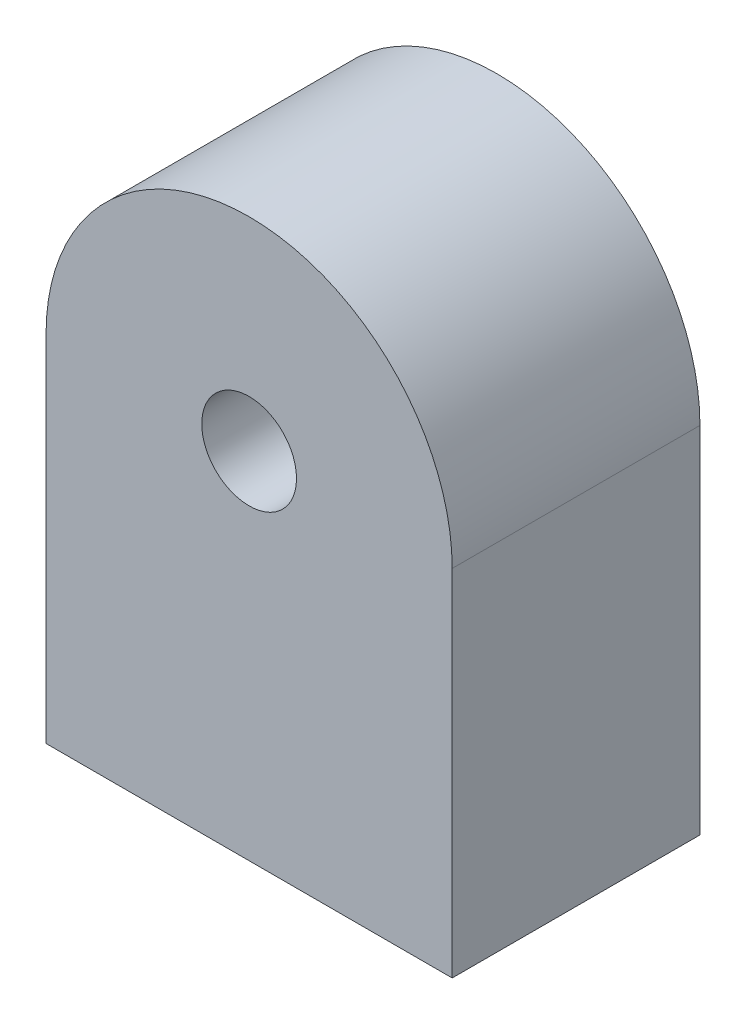
ISO-10303-21;
HEADER;
FILE_DESCRIPTION(('STEP AP214'),'2;1');
FILE_NAME('part.step','',(''),(''),'','','');
FILE_SCHEMA(('AUTOMOTIVE_DESIGN { 1 0 10303 214 1 1 1 1 }'));
ENDSEC;
DATA;
#1=APPLICATION_CONTEXT('core data for automotive mechanical design processes');
#2=APPLICATION_PROTOCOL_DEFINITION('international standard','automotive_design',2000,#1);
#3=PRODUCT_CONTEXT('',#1,'mechanical');
#4=PRODUCT('Part','Part','',(#3));
#5=PRODUCT_RELATED_PRODUCT_CATEGORY('part','',(#4));
#6=PRODUCT_DEFINITION_FORMATION('','',#4);
#7=PRODUCT_DEFINITION_CONTEXT('part definition',#1,'design');
#8=PRODUCT_DEFINITION('design','',#6,#7);
#9=PRODUCT_DEFINITION_SHAPE('','',#8);
#10=(LENGTH_UNIT() NAMED_UNIT(*) SI_UNIT(.MILLI.,.METRE.));
#11=(NAMED_UNIT(*) PLANE_ANGLE_UNIT() SI_UNIT($,.RADIAN.));
#12=(NAMED_UNIT(*) SI_UNIT($,.STERADIAN.) SOLID_ANGLE_UNIT());
#13=UNCERTAINTY_MEASURE_WITH_UNIT(LENGTH_MEASURE(1.E-05),#10,'distance_accuracy_value','');
#14=(GEOMETRIC_REPRESENTATION_CONTEXT(3) GLOBAL_UNCERTAINTY_ASSIGNED_CONTEXT((#13)) GLOBAL_UNIT_ASSIGNED_CONTEXT((#10,
#11,#12)) REPRESENTATION_CONTEXT('',''));
#15=CARTESIAN_POINT('',(0.,0.,0.));
#16=DIRECTION('',(0.,0.,1.));
#17=DIRECTION('',(1.,0.,0.));
#18=AXIS2_PLACEMENT_3D('',#15,#16,#17);
#19=CARTESIAN_POINT('',(0.,-12.1,0.));
#20=DIRECTION('',(0.,-1.,0.));
#21=DIRECTION('',(0.,0.,-1.));
#22=AXIS2_PLACEMENT_3D('',#19,#20,#21);
#23=PLANE('',#22);
#24=DIRECTION('',(0.,0.,1.));
#25=VECTOR('',#24,1.);
#26=CARTESIAN_POINT('',(7.25,-12.1,9.23));
#27=LINE('',#26,#25);
#28=CARTESIAN_POINT('',(7.25,-12.1,2.13));
#29=VERTEX_POINT('',#28);
#30=CARTESIAN_POINT('',(7.25,-12.1,9.23));
#31=VERTEX_POINT('',#30);
#32=EDGE_CURVE('E377',#29,#31,#27,.T.);
#33=ORIENTED_EDGE('',*,*,#32,.T.);
#34=DIRECTION('',(-1.,0.,0.));
#35=VECTOR('',#34,1.);
#36=CARTESIAN_POINT('',(-7.25,-12.1,9.23));
#37=LINE('',#36,#35);
#38=CARTESIAN_POINT('',(-7.25,-12.1,9.23));
#39=VERTEX_POINT('',#38);
#40=EDGE_CURVE('E380',#31,#39,#37,.T.);
#41=ORIENTED_EDGE('',*,*,#40,.T.);
#42=DIRECTION('',(0.,0.,-1.));
#43=VECTOR('',#42,1.);
#44=CARTESIAN_POINT('',(-7.25,-12.1,9.23));
#45=LINE('',#44,#43);
#46=CARTESIAN_POINT('',(-7.25,-12.1,2.13));
#47=VERTEX_POINT('',#46);
#48=EDGE_CURVE('E384',#39,#47,#45,.T.);
#49=ORIENTED_EDGE('',*,*,#48,.T.);
#50=DIRECTION('',(1.,0.,0.));
#51=VECTOR('',#50,1.);
#52=CARTESIAN_POINT('',(-7.25,-12.1,2.13));
#53=LINE('',#52,#51);
#54=EDGE_CURVE('E387',#47,#29,#53,.T.);
#55=ORIENTED_EDGE('',*,*,#54,.T.);
#56=EDGE_LOOP('',(#33,#41,#49,#55));
#57=FACE_BOUND('',#56,.T.);
#58=DIRECTION('',(-1.,0.,0.));
#59=VECTOR('',#58,1.);
#60=CARTESIAN_POINT('',(-0.320000000000001,-12.1,5.45));
#61=LINE('',#60,#59);
#62=CARTESIAN_POINT('',(0.319999999999999,-12.1,5.45));
#63=VERTEX_POINT('',#62);
#64=CARTESIAN_POINT('',(-0.320000000000001,-12.1,5.45));
#65=VERTEX_POINT('',#64);
#66=EDGE_CURVE('E361',#63,#65,#61,.T.);
#67=ORIENTED_EDGE('',*,*,#66,.F.);
#68=DIRECTION('',(0.,0.,1.));
#69=VECTOR('',#68,1.);
#70=CARTESIAN_POINT('',(0.319999999999999,-12.1,5.45));
#71=LINE('',#70,#69);
#72=CARTESIAN_POINT('',(0.32,-12.1,4.81));
#73=VERTEX_POINT('',#72);
#74=EDGE_CURVE('E317',#73,#63,#71,.T.);
#75=ORIENTED_EDGE('',*,*,#74,.F.);
#76=DIRECTION('',(1.,0.,0.));
#77=VECTOR('',#76,1.);
#78=CARTESIAN_POINT('',(-0.320000000000001,-12.1,4.81));
#79=LINE('',#78,#77);
#80=CARTESIAN_POINT('',(-0.320000000000001,-12.1,4.81));
#81=VERTEX_POINT('',#80);
#82=EDGE_CURVE('E352',#81,#73,#79,.T.);
#83=ORIENTED_EDGE('',*,*,#82,.F.);
#84=DIRECTION('',(0.,0.,-1.));
#85=VECTOR('',#84,1.);
#86=CARTESIAN_POINT('',(-0.320000000000001,-12.1,5.45));
#87=LINE('',#86,#85);
#88=EDGE_CURVE('E363',#65,#81,#87,.T.);
#89=ORIENTED_EDGE('',*,*,#88,.F.);
#90=EDGE_LOOP('',(#67,#75,#83,#89));
#91=FACE_BOUND('',#90,.T.);
#92=DIRECTION('',(-1.,0.,0.));
#93=VECTOR('',#92,1.);
#94=CARTESIAN_POINT('',(-2.22,-12.1,5.45));
#95=LINE('',#94,#93);
#96=CARTESIAN_POINT('',(-2.22,-12.1,5.45));
#97=VERTEX_POINT('',#96);
#98=CARTESIAN_POINT('',(-2.86,-12.1,5.45));
#99=VERTEX_POINT('',#98);
#100=EDGE_CURVE('E283',#97,#99,#95,.T.);
#101=ORIENTED_EDGE('',*,*,#100,.F.);
#102=DIRECTION('',(0.,0.,1.));
#103=VECTOR('',#102,1.);
#104=CARTESIAN_POINT('',(-2.22,-12.1,5.45));
#105=LINE('',#104,#103);
#106=CARTESIAN_POINT('',(-2.22,-12.1,4.81));
#107=VERTEX_POINT('',#106);
#108=EDGE_CURVE('E285',#107,#97,#105,.T.);
#109=ORIENTED_EDGE('',*,*,#108,.F.);
#110=DIRECTION('',(1.,0.,0.));
#111=VECTOR('',#110,1.);
#112=CARTESIAN_POINT('',(-2.22,-12.1,4.81));
#113=LINE('',#112,#111);
#114=CARTESIAN_POINT('',(-2.86,-12.1,4.81));
#115=VERTEX_POINT('',#114);
#116=EDGE_CURVE('E277',#115,#107,#113,.T.);
#117=ORIENTED_EDGE('',*,*,#116,.F.);
#118=DIRECTION('',(0.,0.,-1.));
#119=VECTOR('',#118,1.);
#120=CARTESIAN_POINT('',(-2.86,-12.1,5.45));
#121=LINE('',#120,#119);
#122=EDGE_CURVE('E279',#99,#115,#121,.T.);
#123=ORIENTED_EDGE('',*,*,#122,.F.);
#124=EDGE_LOOP('',(#101,#109,#117,#123));
#125=FACE_BOUND('',#124,.T.);
#126=DIRECTION('',(0.,0.,1.));
#127=VECTOR('',#126,1.);
#128=CARTESIAN_POINT('',(5.4,-12.1,5.45));
#129=LINE('',#128,#127);
#130=CARTESIAN_POINT('',(5.4,-12.1,4.81));
#131=VERTEX_POINT('',#130);
#132=CARTESIAN_POINT('',(5.4,-12.1,5.45));
#133=VERTEX_POINT('',#132);
#134=EDGE_CURVE('E251',#131,#133,#129,.T.);
#135=ORIENTED_EDGE('',*,*,#134,.F.);
#136=DIRECTION('',(1.,0.,0.));
#137=VECTOR('',#136,1.);
#138=CARTESIAN_POINT('',(4.76,-12.1,4.81));
#139=LINE('',#138,#137);
#140=CARTESIAN_POINT('',(4.76,-12.1,4.81));
#141=VERTEX_POINT('',#140);
#142=EDGE_CURVE('E245',#141,#131,#139,.T.);
#143=ORIENTED_EDGE('',*,*,#142,.F.);
#144=DIRECTION('',(0.,0.,-1.));
#145=VECTOR('',#144,1.);
#146=CARTESIAN_POINT('',(4.76,-12.1,5.45));
#147=LINE('',#146,#145);
#148=CARTESIAN_POINT('',(4.76,-12.1,5.45));
#149=VERTEX_POINT('',#148);
#150=EDGE_CURVE('E226',#149,#141,#147,.T.);
#151=ORIENTED_EDGE('',*,*,#150,.F.);
#152=DIRECTION('',(-1.,0.,0.));
#153=VECTOR('',#152,1.);
#154=CARTESIAN_POINT('',(4.76,-12.1,5.45));
#155=LINE('',#154,#153);
#156=EDGE_CURVE('E238',#133,#149,#155,.T.);
#157=ORIENTED_EDGE('',*,*,#156,.F.);
#158=EDGE_LOOP('',(#135,#143,#151,#157));
#159=FACE_BOUND('',#158,.T.);
#160=DIRECTION('',(-1.,0.,0.));
#161=VECTOR('',#160,1.);
#162=CARTESIAN_POINT('',(-4.76,-12.1,5.45));
#163=LINE('',#162,#161);
#164=CARTESIAN_POINT('',(-4.76,-12.1,5.45));
#165=VERTEX_POINT('',#164);
#166=CARTESIAN_POINT('',(-5.4,-12.1,5.45));
#167=VERTEX_POINT('',#166);
#168=EDGE_CURVE('E337',#165,#167,#163,.T.);
#169=ORIENTED_EDGE('',*,*,#168,.F.);
#170=DIRECTION('',(0.,0.,1.));
#171=VECTOR('',#170,1.);
#172=CARTESIAN_POINT('',(-4.76,-12.1,5.45));
#173=LINE('',#172,#171);
#174=CARTESIAN_POINT('',(-4.76,-12.1,4.81));
#175=VERTEX_POINT('',#174);
#176=EDGE_CURVE('E299',#175,#165,#173,.T.);
#177=ORIENTED_EDGE('',*,*,#176,.F.);
#178=DIRECTION('',(1.,0.,0.));
#179=VECTOR('',#178,1.);
#180=CARTESIAN_POINT('',(-4.76,-12.1,4.81));
#181=LINE('',#180,#179);
#182=CARTESIAN_POINT('',(-5.4,-12.1,4.81));
#183=VERTEX_POINT('',#182);
#184=EDGE_CURVE('E332',#183,#175,#181,.T.);
#185=ORIENTED_EDGE('',*,*,#184,.F.);
#186=DIRECTION('',(0.,0.,-1.));
#187=VECTOR('',#186,1.);
#188=CARTESIAN_POINT('',(-5.4,-12.1,5.45));
#189=LINE('',#188,#187);
#190=EDGE_CURVE('E334',#167,#183,#189,.T.);
#191=ORIENTED_EDGE('',*,*,#190,.F.);
#192=EDGE_LOOP('',(#169,#177,#185,#191));
#193=FACE_BOUND('',#192,.T.);
#194=DIRECTION('',(0.,0.,1.));
#195=VECTOR('',#194,1.);
#196=CARTESIAN_POINT('',(2.86,-12.1,5.45));
#197=LINE('',#196,#195);
#198=CARTESIAN_POINT('',(2.86,-12.1,4.81));
#199=VERTEX_POINT('',#198);
#200=CARTESIAN_POINT('',(2.86,-12.1,5.45));
#201=VERTEX_POINT('',#200);
#202=EDGE_CURVE('E312',#199,#201,#197,.T.);
#203=ORIENTED_EDGE('',*,*,#202,.F.);
#204=DIRECTION('',(1.,0.,0.));
#205=VECTOR('',#204,1.);
#206=CARTESIAN_POINT('',(2.22,-12.1,4.81));
#207=LINE('',#206,#205);
#208=CARTESIAN_POINT('',(2.22,-12.1,4.81));
#209=VERTEX_POINT('',#208);
#210=EDGE_CURVE('E314',#209,#199,#207,.T.);
#211=ORIENTED_EDGE('',*,*,#210,.F.);
#212=DIRECTION('',(0.,0.,-1.));
#213=VECTOR('',#212,1.);
#214=CARTESIAN_POINT('',(2.22,-12.1,5.45));
#215=LINE('',#214,#213);
#216=CARTESIAN_POINT('',(2.22,-12.1,5.45));
#217=VERTEX_POINT('',#216);
#218=EDGE_CURVE('E307',#217,#209,#215,.T.);
#219=ORIENTED_EDGE('',*,*,#218,.F.);
#220=DIRECTION('',(-1.,0.,0.));
#221=VECTOR('',#220,1.);
#222=CARTESIAN_POINT('',(2.22,-12.1,5.45));
#223=LINE('',#222,#221);
#224=EDGE_CURVE('E309',#201,#217,#223,.T.);
#225=ORIENTED_EDGE('',*,*,#224,.F.);
#226=EDGE_LOOP('',(#203,#211,#219,#225));
#227=FACE_BOUND('',#226,.T.);
#228=ADVANCED_FACE('F39',(#57,#91,#125,#159,#193,#227),#23,.T.);
#229=CARTESIAN_POINT('',(15.,13.1,18.3));
#230=DIRECTION('',(-1.,0.,0.));
#231=DIRECTION('',(0.,-1.,0.));
#232=AXIS2_PLACEMENT_3D('',#229,#230,#231);
#233=PLANE('',#232);
#234=DIRECTION('',(0.,1.,0.));
#235=VECTOR('',#234,1.);
#236=CARTESIAN_POINT('',(15.,13.1,0.));
#237=LINE('',#236,#235);
#238=CARTESIAN_POINT('',(15.,-13.1,0.));
#239=VERTEX_POINT('',#238);
#240=CARTESIAN_POINT('',(15.,13.1,0.));
#241=VERTEX_POINT('',#240);
#242=EDGE_CURVE('E402',#239,#241,#237,.T.);
#243=ORIENTED_EDGE('',*,*,#242,.T.);
#244=DIRECTION('',(0.,0.,-1.));
#245=VECTOR('',#244,1.);
#246=CARTESIAN_POINT('',(15.,13.1,18.3));
#247=LINE('',#246,#245);
#248=CARTESIAN_POINT('',(15.,13.1,18.3));
#249=VERTEX_POINT('',#248);
#250=EDGE_CURVE('E11',#249,#241,#247,.T.);
#251=ORIENTED_EDGE('',*,*,#250,.F.);
#252=DIRECTION('',(0.,1.,0.));
#253=VECTOR('',#252,1.);
#254=CARTESIAN_POINT('',(15.,13.1,18.3));
#255=LINE('',#254,#253);
#256=CARTESIAN_POINT('',(15.,-13.1,18.3));
#257=VERTEX_POINT('',#256);
#258=EDGE_CURVE('E409',#257,#249,#255,.T.);
#259=ORIENTED_EDGE('',*,*,#258,.F.);
#260=DIRECTION('',(0.,0.,-1.));
#261=VECTOR('',#260,1.);
#262=CARTESIAN_POINT('',(15.,-13.1,18.3));
#263=LINE('',#262,#261);
#264=EDGE_CURVE('E419',#257,#239,#263,.T.);
#265=ORIENTED_EDGE('',*,*,#264,.T.);
#266=EDGE_LOOP('',(#243,#251,#259,#265));
#267=FACE_BOUND('',#266,.T.);
#268=ADVANCED_FACE('F41',(#267),#233,.F.);
#269=CARTESIAN_POINT('',(0.,13.1,18.3));
#270=DIRECTION('',(0.,0.,-1.));
#271=DIRECTION('',(-1.,0.,0.));
#272=AXIS2_PLACEMENT_3D('',#269,#270,#271);
#273=CYLINDRICAL_SURFACE('',#272,15.);
#274=CARTESIAN_POINT('',(0.,13.1,0.));
#275=DIRECTION('',(0.,0.,1.));
#276=DIRECTION('',(-1.,0.,0.));
#277=AXIS2_PLACEMENT_3D('',#274,#275,#276);
#278=CIRCLE('',#277,15.);
#279=CARTESIAN_POINT('',(-15.,13.1,0.));
#280=VERTEX_POINT('',#279);
#281=EDGE_CURVE('E422',#241,#280,#278,.T.);
#282=ORIENTED_EDGE('',*,*,#281,.T.);
#283=DIRECTION('',(0.,0.,-1.));
#284=VECTOR('',#283,1.);
#285=CARTESIAN_POINT('',(-15.,13.1,18.3));
#286=LINE('',#285,#284);
#287=CARTESIAN_POINT('',(-15.,13.1,18.3));
#288=VERTEX_POINT('',#287);
#289=EDGE_CURVE('E47',#288,#280,#286,.T.);
#290=ORIENTED_EDGE('',*,*,#289,.F.);
#291=CARTESIAN_POINT('',(0.,13.1,18.3));
#292=DIRECTION('',(0.,0.,1.));
#293=DIRECTION('',(-1.,0.,0.));
#294=AXIS2_PLACEMENT_3D('',#291,#292,#293);
#295=CIRCLE('',#294,15.);
#296=EDGE_CURVE('E412',#249,#288,#295,.T.);
#297=ORIENTED_EDGE('',*,*,#296,.F.);
#298=ORIENTED_EDGE('',*,*,#250,.T.);
#299=EDGE_LOOP('',(#282,#290,#297,#298));
#300=FACE_BOUND('',#299,.T.);
#301=ADVANCED_FACE('F452',(#300),#273,.T.);
#302=CARTESIAN_POINT('',(-15.,13.1,18.3));
#303=DIRECTION('',(1.,0.,0.));
#304=DIRECTION('',(0.,1.,0.));
#305=AXIS2_PLACEMENT_3D('',#302,#303,#304);
#306=PLANE('',#305);
#307=DIRECTION('',(0.,-1.,0.));
#308=VECTOR('',#307,1.);
#309=CARTESIAN_POINT('',(-15.,13.1,0.));
#310=LINE('',#309,#308);
#311=CARTESIAN_POINT('',(-15.,-13.1,0.));
#312=VERTEX_POINT('',#311);
#313=EDGE_CURVE('E424',#280,#312,#310,.T.);
#314=ORIENTED_EDGE('',*,*,#313,.T.);
#315=DIRECTION('',(0.,0.,-1.));
#316=VECTOR('',#315,1.);
#317=CARTESIAN_POINT('',(-15.,-13.1,18.3));
#318=LINE('',#317,#316);
#319=CARTESIAN_POINT('',(-15.,-13.1,18.3));
#320=VERTEX_POINT('',#319);
#321=EDGE_CURVE('E429',#320,#312,#318,.T.);
#322=ORIENTED_EDGE('',*,*,#321,.F.);
#323=DIRECTION('',(0.,-1.,0.));
#324=VECTOR('',#323,1.);
#325=CARTESIAN_POINT('',(-15.,13.1,18.3));
#326=LINE('',#325,#324);
#327=EDGE_CURVE('E415',#288,#320,#326,.T.);
#328=ORIENTED_EDGE('',*,*,#327,.F.);
#329=ORIENTED_EDGE('',*,*,#289,.T.);
#330=EDGE_LOOP('',(#314,#322,#328,#329));
#331=FACE_BOUND('',#330,.T.);
#332=ADVANCED_FACE('F436',(#331),#306,.F.);
#333=CARTESIAN_POINT('',(-15.,-13.1,18.3));
#334=DIRECTION('',(0.,1.,0.));
#335=DIRECTION('',(0.,0.,1.));
#336=AXIS2_PLACEMENT_3D('',#333,#334,#335);
#337=PLANE('',#336);
#338=DIRECTION('',(-1.,0.,0.));
#339=VECTOR('',#338,1.);
#340=CARTESIAN_POINT('',(-7.25,-13.1,9.23));
#341=LINE('',#340,#339);
#342=CARTESIAN_POINT('',(7.25,-13.1,9.23));
#343=VERTEX_POINT('',#342);
#344=CARTESIAN_POINT('',(-7.25,-13.1,9.23));
#345=VERTEX_POINT('',#344);
#346=EDGE_CURVE('E392',#343,#345,#341,.T.);
#347=ORIENTED_EDGE('',*,*,#346,.F.);
#348=DIRECTION('',(0.,0.,1.));
#349=VECTOR('',#348,1.);
#350=CARTESIAN_POINT('',(7.25,-13.1,9.23));
#351=LINE('',#350,#349);
#352=CARTESIAN_POINT('',(7.25,-13.1,2.13));
#353=VERTEX_POINT('',#352);
#354=EDGE_CURVE('E376',#353,#343,#351,.T.);
#355=ORIENTED_EDGE('',*,*,#354,.F.);
#356=DIRECTION('',(1.,0.,0.));
#357=VECTOR('',#356,1.);
#358=CARTESIAN_POINT('',(-7.25,-13.1,2.13));
#359=LINE('',#358,#357);
#360=CARTESIAN_POINT('',(-7.25,-13.1,2.13));
#361=VERTEX_POINT('',#360);
#362=EDGE_CURVE('E381',#361,#353,#359,.T.);
#363=ORIENTED_EDGE('',*,*,#362,.F.);
#364=DIRECTION('',(0.,0.,-1.));
#365=VECTOR('',#364,1.);
#366=CARTESIAN_POINT('',(-7.25,-13.1,9.23));
#367=LINE('',#366,#365);
#368=EDGE_CURVE('E395',#345,#361,#367,.T.);
#369=ORIENTED_EDGE('',*,*,#368,.F.);
#370=EDGE_LOOP('',(#347,#355,#363,#369));
#371=FACE_BOUND('',#370,.T.);
#372=DIRECTION('',(1.,0.,0.));
#373=VECTOR('',#372,1.);
#374=CARTESIAN_POINT('',(-15.,-13.1,0.));
#375=LINE('',#374,#373);
#376=EDGE_CURVE('E413',#312,#239,#375,.T.);
#377=ORIENTED_EDGE('',*,*,#376,.T.);
#378=ORIENTED_EDGE('',*,*,#264,.F.);
#379=DIRECTION('',(1.,0.,0.));
#380=VECTOR('',#379,1.);
#381=CARTESIAN_POINT('',(-15.,-13.1,18.3));
#382=LINE('',#381,#380);
#383=EDGE_CURVE('E417',#320,#257,#382,.T.);
#384=ORIENTED_EDGE('',*,*,#383,.F.);
#385=ORIENTED_EDGE('',*,*,#321,.T.);
#386=EDGE_LOOP('',(#377,#378,#384,#385));
#387=FACE_BOUND('',#386,.T.);
#388=ADVANCED_FACE('F445',(#371,#387),#337,.F.);
#389=CARTESIAN_POINT('',(0.,13.1,18.3));
#390=DIRECTION('',(0.,0.,-1.));
#391=DIRECTION('',(-1.,0.,0.));
#392=AXIS2_PLACEMENT_3D('',#389,#390,#391);
#393=PLANE('',#392);
#394=CARTESIAN_POINT('',(0.,13.1,18.3));
#395=DIRECTION('',(0.,0.,1.));
#396=DIRECTION('',(1.,0.,0.));
#397=AXIS2_PLACEMENT_3D('',#394,#395,#396);
#398=CIRCLE('',#397,3.5);
#399=CARTESIAN_POINT('',(3.5,13.1,18.3));
#400=VERTEX_POINT('',#399);
#401=EDGE_CURVE('E819',#400,#400,#398,.T.);
#402=ORIENTED_EDGE('',*,*,#401,.F.);
#403=EDGE_LOOP('',(#402));
#404=FACE_BOUND('',#403,.T.);
#405=ORIENTED_EDGE('',*,*,#258,.T.);
#406=ORIENTED_EDGE('',*,*,#296,.T.);
#407=ORIENTED_EDGE('',*,*,#327,.T.);
#408=ORIENTED_EDGE('',*,*,#383,.T.);
#409=EDGE_LOOP('',(#405,#406,#407,#408));
#410=FACE_BOUND('',#409,.T.);
#411=ADVANCED_FACE('F451',(#404,#410),#393,.F.);
#412=CARTESIAN_POINT('',(0.,13.1,0.));
#413=DIRECTION('',(0.,0.,-1.));
#414=DIRECTION('',(-1.,0.,0.));
#415=AXIS2_PLACEMENT_3D('',#412,#413,#414);
#416=PLANE('',#415);
#417=CARTESIAN_POINT('',(0.,13.1,0.));
#418=DIRECTION('',(0.,0.,1.));
#419=DIRECTION('',(1.,0.,0.));
#420=AXIS2_PLACEMENT_3D('',#417,#418,#419);
#421=CIRCLE('',#420,3.5);
#422=CARTESIAN_POINT('',(3.5,13.1,0.));
#423=VERTEX_POINT('',#422);
#424=EDGE_CURVE('E268',#423,#423,#421,.T.);
#425=ORIENTED_EDGE('',*,*,#424,.T.);
#426=EDGE_LOOP('',(#425));
#427=FACE_BOUND('',#426,.T.);
#428=ORIENTED_EDGE('',*,*,#242,.F.);
#429=ORIENTED_EDGE('',*,*,#376,.F.);
#430=ORIENTED_EDGE('',*,*,#313,.F.);
#431=ORIENTED_EDGE('',*,*,#281,.F.);
#432=EDGE_LOOP('',(#428,#429,#430,#431));
#433=FACE_BOUND('',#432,.T.);
#434=ADVANCED_FACE('F442',(#427,#433),#416,.T.);
#435=CARTESIAN_POINT('',(7.25,-12.1,9.23));
#436=DIRECTION('',(1.,0.,0.));
#437=DIRECTION('',(0.,0.,-1.));
#438=AXIS2_PLACEMENT_3D('',#435,#436,#437);
#439=PLANE('',#438);
#440=ORIENTED_EDGE('',*,*,#354,.T.);
#441=DIRECTION('',(0.,-1.,0.));
#442=VECTOR('',#441,1.);
#443=CARTESIAN_POINT('',(7.25,-12.1,9.23));
#444=LINE('',#443,#442);
#445=EDGE_CURVE('E390',#31,#343,#444,.T.);
#446=ORIENTED_EDGE('',*,*,#445,.F.);
#447=ORIENTED_EDGE('',*,*,#32,.F.);
#448=DIRECTION('',(0.,-1.,0.));
#449=VECTOR('',#448,1.);
#450=CARTESIAN_POINT('',(7.25,-12.1,2.13));
#451=LINE('',#450,#449);
#452=EDGE_CURVE('E400',#29,#353,#451,.T.);
#453=ORIENTED_EDGE('',*,*,#452,.T.);
#454=EDGE_LOOP('',(#440,#446,#447,#453));
#455=FACE_BOUND('',#454,.T.);
#456=ADVANCED_FACE('F475',(#455),#439,.F.);
#457=CARTESIAN_POINT('',(-7.25,-12.1,2.13));
#458=DIRECTION('',(0.,0.,-1.));
#459=DIRECTION('',(-1.,0.,0.));
#460=AXIS2_PLACEMENT_3D('',#457,#458,#459);
#461=PLANE('',#460);
#462=ORIENTED_EDGE('',*,*,#362,.T.);
#463=ORIENTED_EDGE('',*,*,#452,.F.);
#464=ORIENTED_EDGE('',*,*,#54,.F.);
#465=DIRECTION('',(0.,-1.,0.));
#466=VECTOR('',#465,1.);
#467=CARTESIAN_POINT('',(-7.25,-12.1,2.13));
#468=LINE('',#467,#466);
#469=EDGE_CURVE('E403',#47,#361,#468,.T.);
#470=ORIENTED_EDGE('',*,*,#469,.T.);
#471=EDGE_LOOP('',(#462,#463,#464,#470));
#472=FACE_BOUND('',#471,.T.);
#473=ADVANCED_FACE('F471',(#472),#461,.F.);
#474=CARTESIAN_POINT('',(-7.25,-12.1,9.23));
#475=DIRECTION('',(-1.,0.,0.));
#476=DIRECTION('',(0.,0.,1.));
#477=AXIS2_PLACEMENT_3D('',#474,#475,#476);
#478=PLANE('',#477);
#479=ORIENTED_EDGE('',*,*,#368,.T.);
#480=ORIENTED_EDGE('',*,*,#469,.F.);
#481=ORIENTED_EDGE('',*,*,#48,.F.);
#482=DIRECTION('',(0.,-1.,0.));
#483=VECTOR('',#482,1.);
#484=CARTESIAN_POINT('',(-7.25,-12.1,9.23));
#485=LINE('',#484,#483);
#486=EDGE_CURVE('E405',#39,#345,#485,.T.);
#487=ORIENTED_EDGE('',*,*,#486,.T.);
#488=EDGE_LOOP('',(#479,#480,#481,#487));
#489=FACE_BOUND('',#488,.T.);
#490=ADVANCED_FACE('F474',(#489),#478,.F.);
#491=CARTESIAN_POINT('',(-7.25,-12.1,9.23));
#492=DIRECTION('',(0.,0.,1.));
#493=DIRECTION('',(1.,0.,0.));
#494=AXIS2_PLACEMENT_3D('',#491,#492,#493);
#495=PLANE('',#494);
#496=ORIENTED_EDGE('',*,*,#346,.T.);
#497=ORIENTED_EDGE('',*,*,#486,.F.);
#498=ORIENTED_EDGE('',*,*,#40,.F.);
#499=ORIENTED_EDGE('',*,*,#445,.T.);
#500=EDGE_LOOP('',(#496,#497,#498,#499));
#501=FACE_BOUND('',#500,.T.);
#502=ADVANCED_FACE('F479',(#501),#495,.F.);
#503=CARTESIAN_POINT('',(0.319999999999999,-13.1,5.45));
#504=DIRECTION('',(-1.,0.,0.));
#505=DIRECTION('',(0.,0.,1.));
#506=AXIS2_PLACEMENT_3D('',#503,#504,#505);
#507=PLANE('',#506);
#508=ORIENTED_EDGE('',*,*,#74,.T.);
#509=DIRECTION('',(0.,1.,0.));
#510=VECTOR('',#509,1.);
#511=CARTESIAN_POINT('',(0.319999999999999,-13.1,5.45));
#512=LINE('',#511,#510);
#513=CARTESIAN_POINT('',(0.319999999999999,-13.1,5.45));
#514=VERTEX_POINT('',#513);
#515=EDGE_CURVE('E374',#514,#63,#512,.T.);
#516=ORIENTED_EDGE('',*,*,#515,.F.);
#517=DIRECTION('',(0.,0.,1.));
#518=VECTOR('',#517,1.);
#519=CARTESIAN_POINT('',(0.319999999999999,-13.1,5.45));
#520=LINE('',#519,#518);
#521=CARTESIAN_POINT('',(0.32,-13.1,4.81));
#522=VERTEX_POINT('',#521);
#523=EDGE_CURVE('E348',#522,#514,#520,.T.);
#524=ORIENTED_EDGE('',*,*,#523,.F.);
#525=DIRECTION('',(0.,1.,0.));
#526=VECTOR('',#525,1.);
#527=CARTESIAN_POINT('',(0.32,-13.1,4.81));
#528=LINE('',#527,#526);
#529=EDGE_CURVE('E358',#522,#73,#528,.T.);
#530=ORIENTED_EDGE('',*,*,#529,.T.);
#531=EDGE_LOOP('',(#508,#516,#524,#530));
#532=FACE_BOUND('',#531,.T.);
#533=ADVANCED_FACE('F469',(#532),#507,.F.);
#534=CARTESIAN_POINT('',(-0.320000000000001,-13.1,5.45));
#535=DIRECTION('',(0.,0.,-1.));
#536=DIRECTION('',(-1.,0.,0.));
#537=AXIS2_PLACEMENT_3D('',#534,#535,#536);
#538=PLANE('',#537);
#539=ORIENTED_EDGE('',*,*,#66,.T.);
#540=DIRECTION('',(0.,1.,0.));
#541=VECTOR('',#540,1.);
#542=CARTESIAN_POINT('',(-0.320000000000001,-13.1,5.45));
#543=LINE('',#542,#541);
#544=CARTESIAN_POINT('',(-0.320000000000001,-13.1,5.45));
#545=VERTEX_POINT('',#544);
#546=EDGE_CURVE('E371',#545,#65,#543,.T.);
#547=ORIENTED_EDGE('',*,*,#546,.F.);
#548=DIRECTION('',(-1.,0.,0.));
#549=VECTOR('',#548,1.);
#550=CARTESIAN_POINT('',(-0.320000000000001,-13.1,5.45));
#551=LINE('',#550,#549);
#552=EDGE_CURVE('E351',#514,#545,#551,.T.);
#553=ORIENTED_EDGE('',*,*,#552,.F.);
#554=ORIENTED_EDGE('',*,*,#515,.T.);
#555=EDGE_LOOP('',(#539,#547,#553,#554));
#556=FACE_BOUND('',#555,.T.);
#557=ADVANCED_FACE('F541',(#556),#538,.F.);
#558=CARTESIAN_POINT('',(-0.320000000000001,-13.1,5.45));
#559=DIRECTION('',(1.,0.,0.));
#560=DIRECTION('',(0.,0.,-1.));
#561=AXIS2_PLACEMENT_3D('',#558,#559,#560);
#562=PLANE('',#561);
#563=ORIENTED_EDGE('',*,*,#88,.T.);
#564=DIRECTION('',(0.,1.,0.));
#565=VECTOR('',#564,1.);
#566=CARTESIAN_POINT('',(-0.320000000000001,-13.1,4.81));
#567=LINE('',#566,#565);
#568=CARTESIAN_POINT('',(-0.320000000000001,-13.1,4.81));
#569=VERTEX_POINT('',#568);
#570=EDGE_CURVE('E369',#569,#81,#567,.T.);
#571=ORIENTED_EDGE('',*,*,#570,.F.);
#572=DIRECTION('',(0.,0.,-1.));
#573=VECTOR('',#572,1.);
#574=CARTESIAN_POINT('',(-0.320000000000001,-13.1,5.45));
#575=LINE('',#574,#573);
#576=EDGE_CURVE('E354',#545,#569,#575,.T.);
#577=ORIENTED_EDGE('',*,*,#576,.F.);
#578=ORIENTED_EDGE('',*,*,#546,.T.);
#579=EDGE_LOOP('',(#563,#571,#577,#578));
#580=FACE_BOUND('',#579,.T.);
#581=ADVANCED_FACE('F550',(#580),#562,.F.);
#582=CARTESIAN_POINT('',(-0.320000000000001,-13.1,4.81));
#583=DIRECTION('',(0.,0.,1.));
#584=DIRECTION('',(1.,0.,0.));
#585=AXIS2_PLACEMENT_3D('',#582,#583,#584);
#586=PLANE('',#585);
#587=ORIENTED_EDGE('',*,*,#82,.T.);
#588=ORIENTED_EDGE('',*,*,#529,.F.);
#589=DIRECTION('',(1.,0.,0.));
#590=VECTOR('',#589,1.);
#591=CARTESIAN_POINT('',(-0.320000000000001,-13.1,4.81));
#592=LINE('',#591,#590);
#593=EDGE_CURVE('E356',#569,#522,#592,.T.);
#594=ORIENTED_EDGE('',*,*,#593,.F.);
#595=ORIENTED_EDGE('',*,*,#570,.T.);
#596=EDGE_LOOP('',(#587,#588,#594,#595));
#597=FACE_BOUND('',#596,.T.);
#598=ADVANCED_FACE('F559',(#597),#586,.F.);
#599=CARTESIAN_POINT('',(0.,-13.1,0.));
#600=DIRECTION('',(0.,-1.,0.));
#601=DIRECTION('',(0.,0.,-1.));
#602=AXIS2_PLACEMENT_3D('',#599,#600,#601);
#603=PLANE('',#602);
#604=ORIENTED_EDGE('',*,*,#523,.T.);
#605=ORIENTED_EDGE('',*,*,#552,.T.);
#606=ORIENTED_EDGE('',*,*,#576,.T.);
#607=ORIENTED_EDGE('',*,*,#593,.T.);
#608=EDGE_LOOP('',(#604,#605,#606,#607));
#609=FACE_BOUND('',#608,.T.);
#610=ADVANCED_FACE('F569',(#609),#603,.T.);
#611=CARTESIAN_POINT('',(-2.22,-13.1,5.45));
#612=DIRECTION('',(-1.,0.,0.));
#613=DIRECTION('',(0.,0.,1.));
#614=AXIS2_PLACEMENT_3D('',#611,#612,#613);
#615=PLANE('',#614);
#616=ORIENTED_EDGE('',*,*,#108,.T.);
#617=DIRECTION('',(0.,1.,0.));
#618=VECTOR('',#617,1.);
#619=CARTESIAN_POINT('',(-2.22,-13.1,5.45));
#620=LINE('',#619,#618);
#621=CARTESIAN_POINT('',(-2.22,-13.1,5.45));
#622=VERTEX_POINT('',#621);
#623=EDGE_CURVE('E265',#622,#97,#620,.T.);
#624=ORIENTED_EDGE('',*,*,#623,.F.);
#625=DIRECTION('',(0.,0.,1.));
#626=VECTOR('',#625,1.);
#627=CARTESIAN_POINT('',(-2.22,-13.1,5.45));
#628=LINE('',#627,#626);
#629=CARTESIAN_POINT('',(-2.22,-13.1,4.81));
#630=VERTEX_POINT('',#629);
#631=EDGE_CURVE('E280',#630,#622,#628,.T.);
#632=ORIENTED_EDGE('',*,*,#631,.F.);
#633=DIRECTION('',(0.,1.,0.));
#634=VECTOR('',#633,1.);
#635=CARTESIAN_POINT('',(-2.22,-13.1,4.81));
#636=LINE('',#635,#634);
#637=EDGE_CURVE('E273',#630,#107,#636,.T.);
#638=ORIENTED_EDGE('',*,*,#637,.T.);
#639=EDGE_LOOP('',(#616,#624,#632,#638));
#640=FACE_BOUND('',#639,.T.);
#641=ADVANCED_FACE('F579',(#640),#615,.F.);
#642=CARTESIAN_POINT('',(-2.22,-13.1,5.45));
#643=DIRECTION('',(0.,0.,-1.));
#644=DIRECTION('',(-1.,0.,0.));
#645=AXIS2_PLACEMENT_3D('',#642,#643,#644);
#646=PLANE('',#645);
#647=ORIENTED_EDGE('',*,*,#100,.T.);
#648=DIRECTION('',(0.,1.,0.));
#649=VECTOR('',#648,1.);
#650=CARTESIAN_POINT('',(-2.86,-13.1,5.45));
#651=LINE('',#650,#649);
#652=CARTESIAN_POINT('',(-2.86,-13.1,5.45));
#653=VERTEX_POINT('',#652);
#654=EDGE_CURVE('E267',#653,#99,#651,.T.);
#655=ORIENTED_EDGE('',*,*,#654,.F.);
#656=DIRECTION('',(-1.,0.,0.));
#657=VECTOR('',#656,1.);
#658=CARTESIAN_POINT('',(-2.22,-13.1,5.45));
#659=LINE('',#658,#657);
#660=EDGE_CURVE('E292',#622,#653,#659,.T.);
#661=ORIENTED_EDGE('',*,*,#660,.F.);
#662=ORIENTED_EDGE('',*,*,#623,.T.);
#663=EDGE_LOOP('',(#647,#655,#661,#662));
#664=FACE_BOUND('',#663,.T.);
#665=ADVANCED_FACE('F589',(#664),#646,.F.);
#666=CARTESIAN_POINT('',(-2.86,-13.1,5.45));
#667=DIRECTION('',(1.,0.,0.));
#668=DIRECTION('',(0.,0.,-1.));
#669=AXIS2_PLACEMENT_3D('',#666,#667,#668);
#670=PLANE('',#669);
#671=ORIENTED_EDGE('',*,*,#122,.T.);
#672=DIRECTION('',(0.,1.,0.));
#673=VECTOR('',#672,1.);
#674=CARTESIAN_POINT('',(-2.86,-13.1,4.81));
#675=LINE('',#674,#673);
#676=CARTESIAN_POINT('',(-2.86,-13.1,4.81));
#677=VERTEX_POINT('',#676);
#678=EDGE_CURVE('E271',#677,#115,#675,.T.);
#679=ORIENTED_EDGE('',*,*,#678,.F.);
#680=DIRECTION('',(0.,0.,-1.));
#681=VECTOR('',#680,1.);
#682=CARTESIAN_POINT('',(-2.86,-13.1,5.45));
#683=LINE('',#682,#681);
#684=EDGE_CURVE('E290',#653,#677,#683,.T.);
#685=ORIENTED_EDGE('',*,*,#684,.F.);
#686=ORIENTED_EDGE('',*,*,#654,.T.);
#687=EDGE_LOOP('',(#671,#679,#685,#686));
#688=FACE_BOUND('',#687,.T.);
#689=ADVANCED_FACE('F599',(#688),#670,.F.);
#690=CARTESIAN_POINT('',(-2.22,-13.1,4.81));
#691=DIRECTION('',(0.,0.,1.));
#692=DIRECTION('',(1.,0.,0.));
#693=AXIS2_PLACEMENT_3D('',#690,#691,#692);
#694=PLANE('',#693);
#695=ORIENTED_EDGE('',*,*,#116,.T.);
#696=ORIENTED_EDGE('',*,*,#637,.F.);
#697=DIRECTION('',(1.,0.,0.));
#698=VECTOR('',#697,1.);
#699=CARTESIAN_POINT('',(-2.22,-13.1,4.81));
#700=LINE('',#699,#698);
#701=EDGE_CURVE('E276',#677,#630,#700,.T.);
#702=ORIENTED_EDGE('',*,*,#701,.F.);
#703=ORIENTED_EDGE('',*,*,#678,.T.);
#704=EDGE_LOOP('',(#695,#696,#702,#703));
#705=FACE_BOUND('',#704,.T.);
#706=ADVANCED_FACE('F609',(#705),#694,.F.);
#707=CARTESIAN_POINT('',(0.,-13.1,0.));
#708=DIRECTION('',(0.,1.,0.));
#709=DIRECTION('',(0.,0.,1.));
#710=AXIS2_PLACEMENT_3D('',#707,#708,#709);
#711=PLANE('',#710);
#712=ORIENTED_EDGE('',*,*,#631,.T.);
#713=ORIENTED_EDGE('',*,*,#660,.T.);
#714=ORIENTED_EDGE('',*,*,#684,.T.);
#715=ORIENTED_EDGE('',*,*,#701,.T.);
#716=EDGE_LOOP('',(#712,#713,#714,#715));
#717=FACE_BOUND('',#716,.T.);
#718=ADVANCED_FACE('F619',(#717),#711,.F.);
#719=CARTESIAN_POINT('',(4.76,-13.1,4.81));
#720=DIRECTION('',(0.,0.,1.));
#721=DIRECTION('',(1.,0.,0.));
#722=AXIS2_PLACEMENT_3D('',#719,#720,#721);
#723=PLANE('',#722);
#724=ORIENTED_EDGE('',*,*,#142,.T.);
#725=DIRECTION('',(0.,1.,0.));
#726=VECTOR('',#725,1.);
#727=CARTESIAN_POINT('',(5.4,-13.1,4.81));
#728=LINE('',#727,#726);
#729=CARTESIAN_POINT('',(5.4,-13.1,4.81));
#730=VERTEX_POINT('',#729);
#731=EDGE_CURVE('E288',#730,#131,#728,.T.);
#732=ORIENTED_EDGE('',*,*,#731,.F.);
#733=DIRECTION('',(1.,0.,0.));
#734=VECTOR('',#733,1.);
#735=CARTESIAN_POINT('',(4.76,-13.1,4.81));
#736=LINE('',#735,#734);
#737=CARTESIAN_POINT('',(4.76,-13.1,4.81));
#738=VERTEX_POINT('',#737);
#739=EDGE_CURVE('E239',#738,#730,#736,.T.);
#740=ORIENTED_EDGE('',*,*,#739,.F.);
#741=DIRECTION('',(0.,1.,0.));
#742=VECTOR('',#741,1.);
#743=CARTESIAN_POINT('',(4.76,-13.1,4.81));
#744=LINE('',#743,#742);
#745=EDGE_CURVE('E230',#738,#141,#744,.T.);
#746=ORIENTED_EDGE('',*,*,#745,.T.);
#747=EDGE_LOOP('',(#724,#732,#740,#746));
#748=FACE_BOUND('',#747,.T.);
#749=ADVANCED_FACE('F243',(#748),#723,.F.);
#750=CARTESIAN_POINT('',(5.4,-13.1,5.45));
#751=DIRECTION('',(-1.,0.,0.));
#752=DIRECTION('',(0.,0.,1.));
#753=AXIS2_PLACEMENT_3D('',#750,#751,#752);
#754=PLANE('',#753);
#755=ORIENTED_EDGE('',*,*,#134,.T.);
#756=DIRECTION('',(0.,1.,0.));
#757=VECTOR('',#756,1.);
#758=CARTESIAN_POINT('',(5.4,-13.1,5.45));
#759=LINE('',#758,#757);
#760=CARTESIAN_POINT('',(5.4,-13.1,5.45));
#761=VERTEX_POINT('',#760);
#762=EDGE_CURVE('E824',#761,#133,#759,.T.);
#763=ORIENTED_EDGE('',*,*,#762,.F.);
#764=DIRECTION('',(0.,0.,1.));
#765=VECTOR('',#764,1.);
#766=CARTESIAN_POINT('',(5.4,-13.1,5.45));
#767=LINE('',#766,#765);
#768=EDGE_CURVE('E262',#730,#761,#767,.T.);
#769=ORIENTED_EDGE('',*,*,#768,.F.);
#770=ORIENTED_EDGE('',*,*,#731,.T.);
#771=EDGE_LOOP('',(#755,#763,#769,#770));
#772=FACE_BOUND('',#771,.T.);
#773=ADVANCED_FACE('F638',(#772),#754,.F.);
#774=CARTESIAN_POINT('',(4.76,-13.1,5.45));
#775=DIRECTION('',(0.,0.,-1.));
#776=DIRECTION('',(-1.,0.,0.));
#777=AXIS2_PLACEMENT_3D('',#774,#775,#776);
#778=PLANE('',#777);
#779=ORIENTED_EDGE('',*,*,#156,.T.);
#780=DIRECTION('',(0.,1.,0.));
#781=VECTOR('',#780,1.);
#782=CARTESIAN_POINT('',(4.76,-13.1,5.45));
#783=LINE('',#782,#781);
#784=CARTESIAN_POINT('',(4.76,-13.1,5.45));
#785=VERTEX_POINT('',#784);
#786=EDGE_CURVE('E233',#785,#149,#783,.T.);
#787=ORIENTED_EDGE('',*,*,#786,.F.);
#788=DIRECTION('',(-1.,0.,0.));
#789=VECTOR('',#788,1.);
#790=CARTESIAN_POINT('',(4.76,-13.1,5.45));
#791=LINE('',#790,#789);
#792=EDGE_CURVE('E260',#761,#785,#791,.T.);
#793=ORIENTED_EDGE('',*,*,#792,.F.);
#794=ORIENTED_EDGE('',*,*,#762,.T.);
#795=EDGE_LOOP('',(#779,#787,#793,#794));
#796=FACE_BOUND('',#795,.T.);
#797=ADVANCED_FACE('F647',(#796),#778,.F.);
#798=CARTESIAN_POINT('',(4.76,-13.1,5.45));
#799=DIRECTION('',(1.,0.,0.));
#800=DIRECTION('',(0.,0.,-1.));
#801=AXIS2_PLACEMENT_3D('',#798,#799,#800);
#802=PLANE('',#801);
#803=ORIENTED_EDGE('',*,*,#150,.T.);
#804=ORIENTED_EDGE('',*,*,#745,.F.);
#805=DIRECTION('',(0.,0.,-1.));
#806=VECTOR('',#805,1.);
#807=CARTESIAN_POINT('',(4.76,-13.1,5.45));
#808=LINE('',#807,#806);
#809=EDGE_CURVE('E248',#785,#738,#808,.T.);
#810=ORIENTED_EDGE('',*,*,#809,.F.);
#811=ORIENTED_EDGE('',*,*,#786,.T.);
#812=EDGE_LOOP('',(#803,#804,#810,#811));
#813=FACE_BOUND('',#812,.T.);
#814=ADVANCED_FACE('F228',(#813),#802,.F.);
#815=CARTESIAN_POINT('',(0.,-13.1,0.));
#816=DIRECTION('',(0.,1.,0.));
#817=DIRECTION('',(0.,0.,1.));
#818=AXIS2_PLACEMENT_3D('',#815,#816,#817);
#819=PLANE('',#818);
#820=ORIENTED_EDGE('',*,*,#739,.T.);
#821=ORIENTED_EDGE('',*,*,#768,.T.);
#822=ORIENTED_EDGE('',*,*,#792,.T.);
#823=ORIENTED_EDGE('',*,*,#809,.T.);
#824=EDGE_LOOP('',(#820,#821,#822,#823));
#825=FACE_BOUND('',#824,.T.);
#826=ADVANCED_FACE('F666',(#825),#819,.F.);
#827=CARTESIAN_POINT('',(-4.76,-13.1,5.45));
#828=DIRECTION('',(-1.,0.,0.));
#829=DIRECTION('',(0.,0.,1.));
#830=AXIS2_PLACEMENT_3D('',#827,#828,#829);
#831=PLANE('',#830);
#832=ORIENTED_EDGE('',*,*,#176,.T.);
#833=DIRECTION('',(0.,1.,0.));
#834=VECTOR('',#833,1.);
#835=CARTESIAN_POINT('',(-4.76,-13.1,5.45));
#836=LINE('',#835,#834);
#837=CARTESIAN_POINT('',(-4.76,-13.1,5.45));
#838=VERTEX_POINT('',#837);
#839=EDGE_CURVE('E252',#838,#165,#836,.T.);
#840=ORIENTED_EDGE('',*,*,#839,.F.);
#841=DIRECTION('',(0.,0.,1.));
#842=VECTOR('',#841,1.);
#843=CARTESIAN_POINT('',(-4.76,-13.1,5.45));
#844=LINE('',#843,#842);
#845=CARTESIAN_POINT('',(-4.76,-13.1,4.81));
#846=VERTEX_POINT('',#845);
#847=EDGE_CURVE('E335',#846,#838,#844,.T.);
#848=ORIENTED_EDGE('',*,*,#847,.F.);
#849=DIRECTION('',(0.,1.,0.));
#850=VECTOR('',#849,1.);
#851=CARTESIAN_POINT('',(-4.76,-13.1,4.81));
#852=LINE('',#851,#850);
#853=EDGE_CURVE('E328',#846,#175,#852,.T.);
#854=ORIENTED_EDGE('',*,*,#853,.T.);
#855=EDGE_LOOP('',(#832,#840,#848,#854));
#856=FACE_BOUND('',#855,.T.);
#857=ADVANCED_FACE('F675',(#856),#831,.F.);
#858=CARTESIAN_POINT('',(-4.76,-13.1,5.45));
#859=DIRECTION('',(0.,0.,-1.));
#860=DIRECTION('',(-1.,0.,0.));
#861=AXIS2_PLACEMENT_3D('',#858,#859,#860);
#862=PLANE('',#861);
#863=ORIENTED_EDGE('',*,*,#168,.T.);
#864=DIRECTION('',(0.,1.,0.));
#865=VECTOR('',#864,1.);
#866=CARTESIAN_POINT('',(-5.4,-13.1,5.45));
#867=LINE('',#866,#865);
#868=CARTESIAN_POINT('',(-5.4,-13.1,5.45));
#869=VERTEX_POINT('',#868);
#870=EDGE_CURVE('E254',#869,#167,#867,.T.);
#871=ORIENTED_EDGE('',*,*,#870,.F.);
#872=DIRECTION('',(-1.,0.,0.));
#873=VECTOR('',#872,1.);
#874=CARTESIAN_POINT('',(-4.76,-13.1,5.45));
#875=LINE('',#874,#873);
#876=EDGE_CURVE('E344',#838,#869,#875,.T.);
#877=ORIENTED_EDGE('',*,*,#876,.F.);
#878=ORIENTED_EDGE('',*,*,#839,.T.);
#879=EDGE_LOOP('',(#863,#871,#877,#878));
#880=FACE_BOUND('',#879,.T.);
#881=ADVANCED_FACE('F685',(#880),#862,.F.);
#882=CARTESIAN_POINT('',(-5.4,-13.1,5.45));
#883=DIRECTION('',(1.,0.,0.));
#884=DIRECTION('',(0.,0.,-1.));
#885=AXIS2_PLACEMENT_3D('',#882,#883,#884);
#886=PLANE('',#885);
#887=ORIENTED_EDGE('',*,*,#190,.T.);
#888=DIRECTION('',(0.,1.,0.));
#889=VECTOR('',#888,1.);
#890=CARTESIAN_POINT('',(-5.4,-13.1,4.81));
#891=LINE('',#890,#889);
#892=CARTESIAN_POINT('',(-5.4,-13.1,4.81));
#893=VERTEX_POINT('',#892);
#894=EDGE_CURVE('E62',#893,#183,#891,.T.);
#895=ORIENTED_EDGE('',*,*,#894,.F.);
#896=DIRECTION('',(0.,0.,-1.));
#897=VECTOR('',#896,1.);
#898=CARTESIAN_POINT('',(-5.4,-13.1,5.45));
#899=LINE('',#898,#897);
#900=EDGE_CURVE('E342',#869,#893,#899,.T.);
#901=ORIENTED_EDGE('',*,*,#900,.F.);
#902=ORIENTED_EDGE('',*,*,#870,.T.);
#903=EDGE_LOOP('',(#887,#895,#901,#902));
#904=FACE_BOUND('',#903,.T.);
#905=ADVANCED_FACE('F695',(#904),#886,.F.);
#906=CARTESIAN_POINT('',(-4.76,-13.1,4.81));
#907=DIRECTION('',(0.,0.,1.));
#908=DIRECTION('',(1.,0.,0.));
#909=AXIS2_PLACEMENT_3D('',#906,#907,#908);
#910=PLANE('',#909);
#911=ORIENTED_EDGE('',*,*,#184,.T.);
#912=ORIENTED_EDGE('',*,*,#853,.F.);
#913=DIRECTION('',(1.,0.,0.));
#914=VECTOR('',#913,1.);
#915=CARTESIAN_POINT('',(-4.76,-13.1,4.81));
#916=LINE('',#915,#914);
#917=EDGE_CURVE('E331',#893,#846,#916,.T.);
#918=ORIENTED_EDGE('',*,*,#917,.F.);
#919=ORIENTED_EDGE('',*,*,#894,.T.);
#920=EDGE_LOOP('',(#911,#912,#918,#919));
#921=FACE_BOUND('',#920,.T.);
#922=ADVANCED_FACE('F705',(#921),#910,.F.);
#923=CARTESIAN_POINT('',(0.,-13.1,0.));
#924=DIRECTION('',(0.,1.,0.));
#925=DIRECTION('',(0.,0.,1.));
#926=AXIS2_PLACEMENT_3D('',#923,#924,#925);
#927=PLANE('',#926);
#928=ORIENTED_EDGE('',*,*,#847,.T.);
#929=ORIENTED_EDGE('',*,*,#876,.T.);
#930=ORIENTED_EDGE('',*,*,#900,.T.);
#931=ORIENTED_EDGE('',*,*,#917,.T.);
#932=EDGE_LOOP('',(#928,#929,#930,#931));
#933=FACE_BOUND('',#932,.T.);
#934=ADVANCED_FACE('F715',(#933),#927,.F.);
#935=CARTESIAN_POINT('',(2.22,-13.1,4.81));
#936=DIRECTION('',(0.,0.,1.));
#937=DIRECTION('',(1.,0.,0.));
#938=AXIS2_PLACEMENT_3D('',#935,#936,#937);
#939=PLANE('',#938);
#940=ORIENTED_EDGE('',*,*,#210,.T.);
#941=DIRECTION('',(0.,1.,0.));
#942=VECTOR('',#941,1.);
#943=CARTESIAN_POINT('',(2.86,-13.1,4.81));
#944=LINE('',#943,#942);
#945=CARTESIAN_POINT('',(2.86,-13.1,4.81));
#946=VERTEX_POINT('',#945);
#947=EDGE_CURVE('E296',#946,#199,#944,.T.);
#948=ORIENTED_EDGE('',*,*,#947,.F.);
#949=DIRECTION('',(1.,0.,0.));
#950=VECTOR('',#949,1.);
#951=CARTESIAN_POINT('',(2.22,-13.1,4.81));
#952=LINE('',#951,#950);
#953=CARTESIAN_POINT('',(2.22,-13.1,4.81));
#954=VERTEX_POINT('',#953);
#955=EDGE_CURVE('E310',#954,#946,#952,.T.);
#956=ORIENTED_EDGE('',*,*,#955,.F.);
#957=DIRECTION('',(0.,1.,0.));
#958=VECTOR('',#957,1.);
#959=CARTESIAN_POINT('',(2.22,-13.1,4.81));
#960=LINE('',#959,#958);
#961=EDGE_CURVE('E303',#954,#209,#960,.T.);
#962=ORIENTED_EDGE('',*,*,#961,.T.);
#963=EDGE_LOOP('',(#940,#948,#956,#962));
#964=FACE_BOUND('',#963,.T.);
#965=ADVANCED_FACE('F724',(#964),#939,.F.);
#966=CARTESIAN_POINT('',(2.86,-13.1,5.45));
#967=DIRECTION('',(-1.,0.,0.));
#968=DIRECTION('',(0.,0.,1.));
#969=AXIS2_PLACEMENT_3D('',#966,#967,#968);
#970=PLANE('',#969);
#971=ORIENTED_EDGE('',*,*,#202,.T.);
#972=DIRECTION('',(0.,1.,0.));
#973=VECTOR('',#972,1.);
#974=CARTESIAN_POINT('',(2.86,-13.1,5.45));
#975=LINE('',#974,#973);
#976=CARTESIAN_POINT('',(2.86,-13.1,5.45));
#977=VERTEX_POINT('',#976);
#978=EDGE_CURVE('E298',#977,#201,#975,.T.);
#979=ORIENTED_EDGE('',*,*,#978,.F.);
#980=DIRECTION('',(0.,0.,1.));
#981=VECTOR('',#980,1.);
#982=CARTESIAN_POINT('',(2.86,-13.1,5.45));
#983=LINE('',#982,#981);
#984=EDGE_CURVE('E321',#946,#977,#983,.T.);
#985=ORIENTED_EDGE('',*,*,#984,.F.);
#986=ORIENTED_EDGE('',*,*,#947,.T.);
#987=EDGE_LOOP('',(#971,#979,#985,#986));
#988=FACE_BOUND('',#987,.T.);
#989=ADVANCED_FACE('F734',(#988),#970,.F.);
#990=CARTESIAN_POINT('',(2.22,-13.1,5.45));
#991=DIRECTION('',(0.,0.,-1.));
#992=DIRECTION('',(-1.,0.,0.));
#993=AXIS2_PLACEMENT_3D('',#990,#991,#992);
#994=PLANE('',#993);
#995=ORIENTED_EDGE('',*,*,#224,.T.);
#996=DIRECTION('',(0.,1.,0.));
#997=VECTOR('',#996,1.);
#998=CARTESIAN_POINT('',(2.22,-13.1,5.45));
#999=LINE('',#998,#997);
#1000=CARTESIAN_POINT('',(2.22,-13.1,5.45));
#1001=VERTEX_POINT('',#1000);
#1002=EDGE_CURVE('E54',#1001,#217,#999,.T.);
#1003=ORIENTED_EDGE('',*,*,#1002,.F.);
#1004=DIRECTION('',(-1.,0.,0.));
#1005=VECTOR('',#1004,1.);
#1006=CARTESIAN_POINT('',(2.22,-13.1,5.45));
#1007=LINE('',#1006,#1005);
#1008=EDGE_CURVE('E319',#977,#1001,#1007,.T.);
#1009=ORIENTED_EDGE('',*,*,#1008,.F.);
#1010=ORIENTED_EDGE('',*,*,#978,.T.);
#1011=EDGE_LOOP('',(#995,#1003,#1009,#1010));
#1012=FACE_BOUND('',#1011,.T.);
#1013=ADVANCED_FACE('F744',(#1012),#994,.F.);
#1014=CARTESIAN_POINT('',(2.22,-13.1,5.45));
#1015=DIRECTION('',(1.,0.,0.));
#1016=DIRECTION('',(0.,0.,-1.));
#1017=AXIS2_PLACEMENT_3D('',#1014,#1015,#1016);
#1018=PLANE('',#1017);
#1019=ORIENTED_EDGE('',*,*,#218,.T.);
#1020=ORIENTED_EDGE('',*,*,#961,.F.);
#1021=DIRECTION('',(0.,0.,-1.));
#1022=VECTOR('',#1021,1.);
#1023=CARTESIAN_POINT('',(2.22,-13.1,5.45));
#1024=LINE('',#1023,#1022);
#1025=EDGE_CURVE('E306',#1001,#954,#1024,.T.);
#1026=ORIENTED_EDGE('',*,*,#1025,.F.);
#1027=ORIENTED_EDGE('',*,*,#1002,.T.);
#1028=EDGE_LOOP('',(#1019,#1020,#1026,#1027));
#1029=FACE_BOUND('',#1028,.T.);
#1030=ADVANCED_FACE('F754',(#1029),#1018,.F.);
#1031=CARTESIAN_POINT('',(0.,-13.1,0.));
#1032=DIRECTION('',(0.,1.,0.));
#1033=DIRECTION('',(0.,0.,1.));
#1034=AXIS2_PLACEMENT_3D('',#1031,#1032,#1033);
#1035=PLANE('',#1034);
#1036=ORIENTED_EDGE('',*,*,#955,.T.);
#1037=ORIENTED_EDGE('',*,*,#984,.T.);
#1038=ORIENTED_EDGE('',*,*,#1008,.T.);
#1039=ORIENTED_EDGE('',*,*,#1025,.T.);
#1040=EDGE_LOOP('',(#1036,#1037,#1038,#1039));
#1041=FACE_BOUND('',#1040,.T.);
#1042=ADVANCED_FACE('F764',(#1041),#1035,.F.);
#1043=CARTESIAN_POINT('',(0.,13.1,0.));
#1044=DIRECTION('',(0.,0.,1.));
#1045=DIRECTION('',(1.,0.,0.));
#1046=AXIS2_PLACEMENT_3D('',#1043,#1044,#1045);
#1047=CYLINDRICAL_SURFACE('',#1046,3.5);
#1048=ORIENTED_EDGE('',*,*,#424,.F.);
#1049=EDGE_LOOP('',(#1048));
#1050=FACE_BOUND('',#1049,.T.);
#1051=ORIENTED_EDGE('',*,*,#401,.T.);
#1052=EDGE_LOOP('',(#1051));
#1053=FACE_BOUND('',#1052,.T.);
#1054=ADVANCED_FACE('F773',(#1050,#1053),#1047,.F.);
#1055=CLOSED_SHELL('',(#228,#268,#301,#332,#388,#411,#434,#456,#473,#490,#502,#533,#557,#581,
#598,#610,#641,#665,#689,#706,#718,#749,#773,#797,#814,#826,#857,#881,#905,#922,#934,#965,#989,
#1013,#1030,#1042,#1054));
#1056=MANIFOLD_SOLID_BREP('B2',#1055);
#1057=ADVANCED_BREP_SHAPE_REPRESENTATION('',(#18,#1056),#14);
#1058=SHAPE_DEFINITION_REPRESENTATION(#9,#1057);
ENDSEC;
END-ISO-10303-21;
